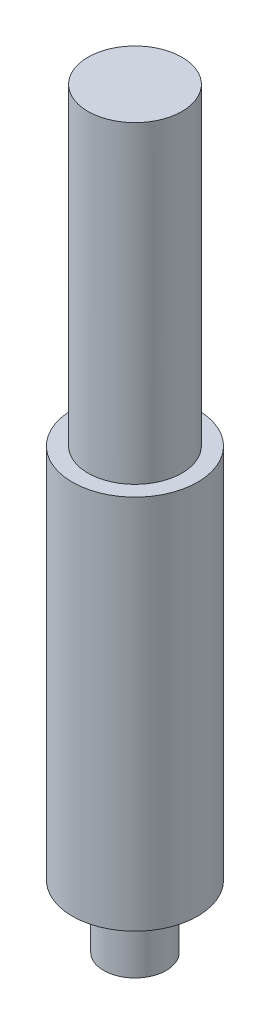
ISO-10303-21;
HEADER;
FILE_DESCRIPTION(('STEP AP214'),'2;1');
FILE_NAME('part.step','',(''),(''),'','','');
FILE_SCHEMA(('AUTOMOTIVE_DESIGN { 1 0 10303 214 1 1 1 1 }'));
ENDSEC;
DATA;
#1=APPLICATION_CONTEXT('core data for automotive mechanical design processes');
#2=APPLICATION_PROTOCOL_DEFINITION('international standard','automotive_design',2000,#1);
#3=PRODUCT_CONTEXT('',#1,'mechanical');
#4=PRODUCT('Part','Part','',(#3));
#5=PRODUCT_RELATED_PRODUCT_CATEGORY('part','',(#4));
#6=PRODUCT_DEFINITION_FORMATION('','',#4);
#7=PRODUCT_DEFINITION_CONTEXT('part definition',#1,'design');
#8=PRODUCT_DEFINITION('design','',#6,#7);
#9=PRODUCT_DEFINITION_SHAPE('','',#8);
#10=(LENGTH_UNIT() NAMED_UNIT(*) SI_UNIT(.MILLI.,.METRE.));
#11=(NAMED_UNIT(*) PLANE_ANGLE_UNIT() SI_UNIT($,.RADIAN.));
#12=(NAMED_UNIT(*) SI_UNIT($,.STERADIAN.) SOLID_ANGLE_UNIT());
#13=UNCERTAINTY_MEASURE_WITH_UNIT(LENGTH_MEASURE(1.E-05),#10,'distance_accuracy_value','');
#14=(GEOMETRIC_REPRESENTATION_CONTEXT(3) GLOBAL_UNCERTAINTY_ASSIGNED_CONTEXT((#13)) GLOBAL_UNIT_ASSIGNED_CONTEXT((#10,
#11,#12)) REPRESENTATION_CONTEXT('',''));
#15=CARTESIAN_POINT('',(0.,0.,0.));
#16=DIRECTION('',(0.,0.,1.));
#17=DIRECTION('',(1.,0.,0.));
#18=AXIS2_PLACEMENT_3D('',#15,#16,#17);
#19=CARTESIAN_POINT('',(0.,-76.2,0.));
#20=DIRECTION('',(0.,-1.,0.));
#21=DIRECTION('',(0.,0.,-1.));
#22=AXIS2_PLACEMENT_3D('',#19,#20,#21);
#23=PLANE('',#22);
#24=CARTESIAN_POINT('',(0.,-76.2,0.));
#25=DIRECTION('',(0.,-1.,0.));
#26=DIRECTION('',(0.,0.,-1.));
#27=AXIS2_PLACEMENT_3D('',#24,#25,#26);
#28=CIRCLE('',#27,12.7);
#29=CARTESIAN_POINT('',(0.,-76.2,12.7));
#30=VERTEX_POINT('',#29);
#31=EDGE_CURVE('E40',#30,#30,#28,.T.);
#32=ORIENTED_EDGE('',*,*,#31,.T.);
#33=EDGE_LOOP('',(#32));
#34=FACE_BOUND('',#33,.T.);
#35=CARTESIAN_POINT('',(0.,-76.2,0.));
#36=DIRECTION('',(0.,-1.,0.));
#37=DIRECTION('',(0.,0.,-1.));
#38=AXIS2_PLACEMENT_3D('',#35,#36,#37);
#39=CIRCLE('',#38,6.35);
#40=CARTESIAN_POINT('',(0.,-76.2,-6.35));
#41=VERTEX_POINT('',#40);
#42=EDGE_CURVE('E50',#41,#41,#39,.T.);
#43=ORIENTED_EDGE('',*,*,#42,.F.);
#44=EDGE_LOOP('',(#43));
#45=FACE_BOUND('',#44,.T.);
#46=ADVANCED_FACE('F29',(#34,#45),#23,.T.);
#47=CARTESIAN_POINT('',(0.,63.5,0.));
#48=DIRECTION('',(0.,-1.,0.));
#49=DIRECTION('',(0.,0.,-1.));
#50=AXIS2_PLACEMENT_3D('',#47,#48,#49);
#51=CYLINDRICAL_SURFACE('',#50,9.525);
#52=CARTESIAN_POINT('',(0.,63.5,0.));
#53=DIRECTION('',(0.,1.,0.));
#54=DIRECTION('',(0.,0.,1.));
#55=AXIS2_PLACEMENT_3D('',#52,#53,#54);
#56=CIRCLE('',#55,9.525);
#57=CARTESIAN_POINT('',(0.,63.5,9.525));
#58=VERTEX_POINT('',#57);
#59=EDGE_CURVE('E10',#58,#58,#56,.T.);
#60=ORIENTED_EDGE('',*,*,#59,.F.);
#61=EDGE_LOOP('',(#60));
#62=FACE_BOUND('',#61,.T.);
#63=CARTESIAN_POINT('',(0.,0.,0.));
#64=DIRECTION('',(0.,-1.,0.));
#65=DIRECTION('',(0.,0.,-1.));
#66=AXIS2_PLACEMENT_3D('',#63,#64,#65);
#67=CIRCLE('',#66,9.525);
#68=CARTESIAN_POINT('',(0.,0.,-9.525));
#69=VERTEX_POINT('',#68);
#70=EDGE_CURVE('E36',#69,#69,#67,.T.);
#71=ORIENTED_EDGE('',*,*,#70,.F.);
#72=EDGE_LOOP('',(#71));
#73=FACE_BOUND('',#72,.T.);
#74=ADVANCED_FACE('F31',(#62,#73),#51,.T.);
#75=CARTESIAN_POINT('',(0.,63.5,0.));
#76=DIRECTION('',(0.,1.,0.));
#77=DIRECTION('',(0.,0.,1.));
#78=AXIS2_PLACEMENT_3D('',#75,#76,#77);
#79=PLANE('',#78);
#80=ORIENTED_EDGE('',*,*,#59,.T.);
#81=EDGE_LOOP('',(#80));
#82=FACE_BOUND('',#81,.T.);
#83=ADVANCED_FACE('F71',(#82),#79,.T.);
#84=CARTESIAN_POINT('',(0.,0.,0.));
#85=DIRECTION('',(0.,-1.,0.));
#86=DIRECTION('',(0.,0.,-1.));
#87=AXIS2_PLACEMENT_3D('',#84,#85,#86);
#88=PLANE('',#87);
#89=CARTESIAN_POINT('',(0.,0.,0.));
#90=DIRECTION('',(0.,-1.,0.));
#91=DIRECTION('',(0.,0.,-1.));
#92=AXIS2_PLACEMENT_3D('',#89,#90,#91);
#93=CIRCLE('',#92,12.7);
#94=CARTESIAN_POINT('',(0.,0.,12.7));
#95=VERTEX_POINT('',#94);
#96=EDGE_CURVE('E44',#95,#95,#93,.T.);
#97=ORIENTED_EDGE('',*,*,#96,.F.);
#98=EDGE_LOOP('',(#97));
#99=FACE_BOUND('',#98,.T.);
#100=ORIENTED_EDGE('',*,*,#70,.T.);
#101=EDGE_LOOP('',(#100));
#102=FACE_BOUND('',#101,.T.);
#103=ADVANCED_FACE('F75',(#99,#102),#88,.F.);
#104=CARTESIAN_POINT('',(0.,-76.2,0.));
#105=DIRECTION('',(0.,1.,0.));
#106=DIRECTION('',(0.,0.,1.));
#107=AXIS2_PLACEMENT_3D('',#104,#105,#106);
#108=CYLINDRICAL_SURFACE('',#107,12.7);
#109=CARTESIAN_POINT('',(0.,-76.2,12.7));
#110=CARTESIAN_POINT('',(0.,-75.40625,12.7));
#111=CARTESIAN_POINT('',(0.,-74.6125,12.7));
#112=CARTESIAN_POINT('',(0.,-73.025,12.7));
#113=CARTESIAN_POINT('',(0.,-72.23125,12.7));
#114=CARTESIAN_POINT('',(0.,-70.64375,12.7));
#115=CARTESIAN_POINT('',(0.,-69.85,12.7));
#116=CARTESIAN_POINT('',(0.,-68.2625,12.7));
#117=CARTESIAN_POINT('',(0.,-67.46875,12.7));
#118=CARTESIAN_POINT('',(0.,-65.88125,12.7));
#119=CARTESIAN_POINT('',(0.,-65.0875,12.7));
#120=CARTESIAN_POINT('',(0.,-63.5,12.7));
#121=CARTESIAN_POINT('',(0.,-62.70625,12.7));
#122=CARTESIAN_POINT('',(0.,-61.11875,12.7));
#123=CARTESIAN_POINT('',(0.,-60.325,12.7));
#124=CARTESIAN_POINT('',(0.,-58.7375,12.7));
#125=CARTESIAN_POINT('',(0.,-57.94375,12.7));
#126=CARTESIAN_POINT('',(0.,-56.35625,12.7));
#127=CARTESIAN_POINT('',(0.,-55.5625,12.7));
#128=CARTESIAN_POINT('',(0.,-53.975,12.7));
#129=CARTESIAN_POINT('',(0.,-53.18125,12.7));
#130=CARTESIAN_POINT('',(0.,-51.59375,12.7));
#131=CARTESIAN_POINT('',(0.,-50.8,12.7));
#132=CARTESIAN_POINT('',(0.,-49.2125,12.7));
#133=CARTESIAN_POINT('',(0.,-48.41875,12.7));
#134=CARTESIAN_POINT('',(0.,-46.83125,12.7));
#135=CARTESIAN_POINT('',(0.,-46.0375,12.7));
#136=CARTESIAN_POINT('',(0.,-44.45,12.7));
#137=CARTESIAN_POINT('',(0.,-43.65625,12.7));
#138=CARTESIAN_POINT('',(0.,-42.06875,12.7));
#139=CARTESIAN_POINT('',(0.,-41.275,12.7));
#140=CARTESIAN_POINT('',(0.,-39.6875,12.7));
#141=CARTESIAN_POINT('',(0.,-38.89375,12.7));
#142=CARTESIAN_POINT('',(0.,-37.30625,12.7));
#143=CARTESIAN_POINT('',(0.,-36.5125,12.7));
#144=CARTESIAN_POINT('',(0.,-34.925,12.7));
#145=CARTESIAN_POINT('',(0.,-34.13125,12.7));
#146=CARTESIAN_POINT('',(0.,-32.54375,12.7));
#147=CARTESIAN_POINT('',(0.,-31.75,12.7));
#148=CARTESIAN_POINT('',(0.,-30.1625,12.7));
#149=CARTESIAN_POINT('',(0.,-29.36875,12.7));
#150=CARTESIAN_POINT('',(0.,-27.78125,12.7));
#151=CARTESIAN_POINT('',(0.,-26.9875,12.7));
#152=CARTESIAN_POINT('',(0.,-25.4,12.7));
#153=CARTESIAN_POINT('',(0.,-24.60625,12.7));
#154=CARTESIAN_POINT('',(0.,-23.01875,12.7));
#155=CARTESIAN_POINT('',(0.,-22.225,12.7));
#156=CARTESIAN_POINT('',(0.,-20.6375,12.7));
#157=CARTESIAN_POINT('',(0.,-19.84375,12.7));
#158=CARTESIAN_POINT('',(0.,-18.25625,12.7));
#159=CARTESIAN_POINT('',(0.,-17.4625,12.7));
#160=CARTESIAN_POINT('',(0.,-15.875,12.7));
#161=CARTESIAN_POINT('',(0.,-15.08125,12.7));
#162=CARTESIAN_POINT('',(0.,-13.49375,12.7));
#163=CARTESIAN_POINT('',(0.,-12.7,12.7));
#164=CARTESIAN_POINT('',(0.,-11.1125,12.7));
#165=CARTESIAN_POINT('',(0.,-10.31875,12.7));
#166=CARTESIAN_POINT('',(0.,-8.73125,12.7));
#167=CARTESIAN_POINT('',(0.,-7.93750000000001,12.7));
#168=CARTESIAN_POINT('',(0.,-6.35,12.7));
#169=CARTESIAN_POINT('',(0.,-5.55625,12.7));
#170=CARTESIAN_POINT('',(0.,-3.96875,12.7));
#171=CARTESIAN_POINT('',(0.,-3.175,12.7));
#172=CARTESIAN_POINT('',(0.,-1.5875,12.7));
#173=CARTESIAN_POINT('',(0.,-0.793750000000001,12.7));
#174=CARTESIAN_POINT('',(0.,0.,12.7));
#175=B_SPLINE_CURVE_WITH_KNOTS('',3,(#109,#110,#111,#112,#113,#114,#115,#116,#117,#118,#119,
#120,#121,#122,#123,#124,#125,#126,#127,#128,#129,#130,#131,#132,#133,#134,#135,#136,#137,#138,
#139,#140,#141,#142,#143,#144,#145,#146,#147,#148,#149,#150,#151,#152,#153,#154,#155,#156,#157,
#158,#159,#160,#161,#162,#163,#164,#165,#166,#167,#168,#169,#170,#171,#172,#173,#174),
.UNSPECIFIED.,.F.,.F.,(4,2,2,2,2,2,2,2,2,2,2,2,2,2,2,2,2,2,2,2,2,2,2,2,2,2,2,2,2,2,2,2,4),(0.,
2.38124999999999,4.76249999999999,7.14374999999999,9.52499999999999,11.90625,14.2875,16.66875,
19.05,21.43125,23.8125,26.19375,28.575,30.95625,33.3375,35.71875,38.1,40.48125,42.8625,45.24375,
47.625,50.00625,52.3875,54.76875,57.15,59.53125,61.9125,64.29375,66.675,69.05625,71.4375,
73.81875,76.2),.UNSPECIFIED.);
#176=EDGE_CURVE('BSEAM61',#30,#95,#175,.T.);
#177=ORIENTED_EDGE('',*,*,#31,.F.);
#178=ORIENTED_EDGE('',*,*,#96,.T.);
#179=ORIENTED_EDGE('',*,*,#176,.T.);
#180=ORIENTED_EDGE('',*,*,#176,.F.);
#181=EDGE_LOOP('',(#177,#179,#178,#180));
#182=FACE_BOUND('',#181,.T.);
#183=ADVANCED_FACE('F61',(#182),#108,.T.);
#184=CARTESIAN_POINT('',(0.,-88.9,0.));
#185=DIRECTION('',(0.,1.,0.));
#186=DIRECTION('',(0.,0.,1.));
#187=AXIS2_PLACEMENT_3D('',#184,#185,#186);
#188=CYLINDRICAL_SURFACE('',#187,6.35);
#189=CARTESIAN_POINT('',(0.,-88.9,0.));
#190=DIRECTION('',(0.,-1.,0.));
#191=DIRECTION('',(0.,0.,-1.));
#192=AXIS2_PLACEMENT_3D('',#189,#190,#191);
#193=CIRCLE('',#192,6.35);
#194=CARTESIAN_POINT('',(0.,-88.9,-6.35));
#195=VERTEX_POINT('',#194);
#196=EDGE_CURVE('E48',#195,#195,#193,.T.);
#197=ORIENTED_EDGE('',*,*,#196,.F.);
#198=EDGE_LOOP('',(#197));
#199=FACE_BOUND('',#198,.T.);
#200=ORIENTED_EDGE('',*,*,#42,.T.);
#201=EDGE_LOOP('',(#200));
#202=FACE_BOUND('',#201,.T.);
#203=ADVANCED_FACE('F58',(#199,#202),#188,.T.);
#204=CARTESIAN_POINT('',(0.,-88.9,0.));
#205=DIRECTION('',(0.,-1.,0.));
#206=DIRECTION('',(0.,0.,-1.));
#207=AXIS2_PLACEMENT_3D('',#204,#205,#206);
#208=PLANE('',#207);
#209=ORIENTED_EDGE('',*,*,#196,.T.);
#210=EDGE_LOOP('',(#209));
#211=FACE_BOUND('',#210,.T.);
#212=ADVANCED_FACE('F56',(#211),#208,.T.);
#213=CLOSED_SHELL('',(#46,#74,#83,#103,#183,#203,#212));
#214=MANIFOLD_SOLID_BREP('B2',#213);
#215=ADVANCED_BREP_SHAPE_REPRESENTATION('',(#18,#214),#14);
#216=SHAPE_DEFINITION_REPRESENTATION(#9,#215);
ENDSEC;
END-ISO-10303-21;
